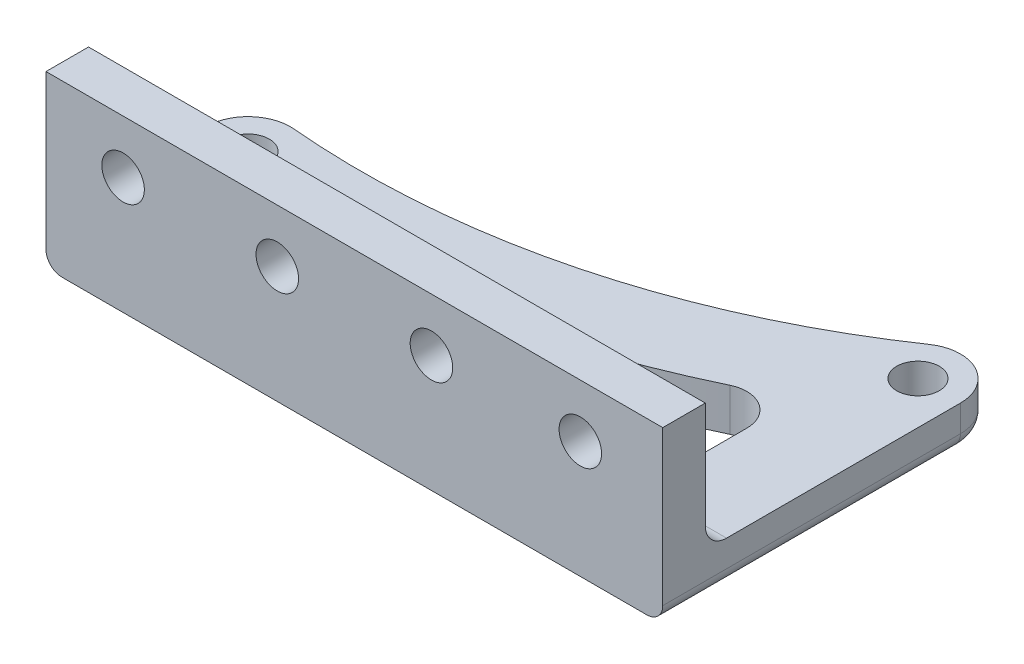
ISO-10303-21;
HEADER;
FILE_DESCRIPTION(('STEP AP214'),'2;1');
FILE_NAME('part.step','',(''),(''),'','','');
FILE_SCHEMA(('AUTOMOTIVE_DESIGN { 1 0 10303 214 1 1 1 1 }'));
ENDSEC;
DATA;
#1=APPLICATION_CONTEXT('core data for automotive mechanical design processes');
#2=APPLICATION_PROTOCOL_DEFINITION('international standard','automotive_design',2000,#1);
#3=PRODUCT_CONTEXT('',#1,'mechanical');
#4=PRODUCT('Part','Part','',(#3));
#5=PRODUCT_RELATED_PRODUCT_CATEGORY('part','',(#4));
#6=PRODUCT_DEFINITION_FORMATION('','',#4);
#7=PRODUCT_DEFINITION_CONTEXT('part definition',#1,'design');
#8=PRODUCT_DEFINITION('design','',#6,#7);
#9=PRODUCT_DEFINITION_SHAPE('','',#8);
#10=(LENGTH_UNIT() NAMED_UNIT(*) SI_UNIT(.MILLI.,.METRE.));
#11=(NAMED_UNIT(*) PLANE_ANGLE_UNIT() SI_UNIT($,.RADIAN.));
#12=(NAMED_UNIT(*) SI_UNIT($,.STERADIAN.) SOLID_ANGLE_UNIT());
#13=UNCERTAINTY_MEASURE_WITH_UNIT(LENGTH_MEASURE(1.E-05),#10,'distance_accuracy_value','');
#14=(GEOMETRIC_REPRESENTATION_CONTEXT(3) GLOBAL_UNCERTAINTY_ASSIGNED_CONTEXT((#13)) GLOBAL_UNIT_ASSIGNED_CONTEXT((#10,
#11,#12)) REPRESENTATION_CONTEXT('',''));
#15=CARTESIAN_POINT('',(0.,0.,0.));
#16=DIRECTION('',(0.,0.,1.));
#17=DIRECTION('',(1.,0.,0.));
#18=AXIS2_PLACEMENT_3D('',#15,#16,#17);
#19=CARTESIAN_POINT('',(-4.,4.,28.));
#20=DIRECTION('',(0.,0.,-1.));
#21=DIRECTION('',(1.,0.,0.));
#22=AXIS2_PLACEMENT_3D('',#19,#20,#21);
#23=PLANE('',#22);
#24=CARTESIAN_POINT('',(3.25,11.,28.));
#25=DIRECTION('',(0.,0.,1.));
#26=DIRECTION('',(1.,0.,0.));
#27=AXIS2_PLACEMENT_3D('',#24,#25,#26);
#28=CIRCLE('',#27,2.);
#29=CARTESIAN_POINT('',(5.25,11.,28.));
#30=VERTEX_POINT('',#29);
#31=EDGE_CURVE('E512',#30,#30,#28,.F.);
#32=ORIENTED_EDGE('',*,*,#31,.T.);
#33=EDGE_LOOP('',(#32));
#34=FACE_BOUND('',#33,.T.);
#35=CARTESIAN_POINT('',(17.75,11.,28.));
#36=DIRECTION('',(0.,0.,1.));
#37=DIRECTION('',(1.,0.,0.));
#38=AXIS2_PLACEMENT_3D('',#35,#36,#37);
#39=CIRCLE('',#38,2.);
#40=CARTESIAN_POINT('',(19.75,11.,28.));
#41=VERTEX_POINT('',#40);
#42=EDGE_CURVE('E198',#41,#41,#39,.F.);
#43=ORIENTED_EDGE('',*,*,#42,.T.);
#44=EDGE_LOOP('',(#43));
#45=FACE_BOUND('',#44,.T.);
#46=DIRECTION('',(0.,-1.,0.));
#47=VECTOR('',#46,1.);
#48=CARTESIAN_POINT('',(54.,4.,28.));
#49=LINE('',#48,#47);
#50=CARTESIAN_POINT('',(54.,16.,28.));
#51=VERTEX_POINT('',#50);
#52=CARTESIAN_POINT('',(54.,1.5,28.));
#53=VERTEX_POINT('',#52);
#54=EDGE_CURVE('E193',#51,#53,#49,.T.);
#55=ORIENTED_EDGE('',*,*,#54,.F.);
#56=DIRECTION('',(-1.,0.,0.));
#57=VECTOR('',#56,1.);
#58=CARTESIAN_POINT('',(54.,16.,28.));
#59=LINE('',#58,#57);
#60=CARTESIAN_POINT('',(-4.,16.,28.));
#61=VERTEX_POINT('',#60);
#62=EDGE_CURVE('E179',#51,#61,#59,.T.);
#63=ORIENTED_EDGE('',*,*,#62,.T.);
#64=DIRECTION('',(0.,-1.,0.));
#65=VECTOR('',#64,1.);
#66=CARTESIAN_POINT('',(-4.,4.,28.));
#67=LINE('',#66,#65);
#68=CARTESIAN_POINT('',(-4.,1.5,28.));
#69=VERTEX_POINT('',#68);
#70=EDGE_CURVE('E187',#61,#69,#67,.T.);
#71=ORIENTED_EDGE('',*,*,#70,.T.);
#72=CARTESIAN_POINT('',(-2.5,1.5,28.));
#73=DIRECTION('',(0.,0.,1.));
#74=DIRECTION('',(1.,0.,0.));
#75=AXIS2_PLACEMENT_3D('',#72,#73,#74);
#76=CIRCLE('',#75,1.5);
#77=CARTESIAN_POINT('',(-2.5,0.,28.));
#78=VERTEX_POINT('',#77);
#79=EDGE_CURVE('E335',#78,#69,#76,.F.);
#80=ORIENTED_EDGE('',*,*,#79,.F.);
#81=DIRECTION('',(-1.,0.,0.));
#82=VECTOR('',#81,1.);
#83=CARTESIAN_POINT('',(-4.,0.,28.));
#84=LINE('',#83,#82);
#85=CARTESIAN_POINT('',(52.5,0.,28.));
#86=VERTEX_POINT('',#85);
#87=EDGE_CURVE('E289',#86,#78,#84,.T.);
#88=ORIENTED_EDGE('',*,*,#87,.F.);
#89=CARTESIAN_POINT('',(52.5,1.5,28.));
#90=DIRECTION('',(0.,0.,1.));
#91=DIRECTION('',(1.,0.,0.));
#92=AXIS2_PLACEMENT_3D('',#89,#90,#91);
#93=CIRCLE('',#92,1.5);
#94=EDGE_CURVE('E337',#53,#86,#93,.F.);
#95=ORIENTED_EDGE('',*,*,#94,.F.);
#96=EDGE_LOOP('',(#55,#63,#71,#80,#88,#95));
#97=FACE_BOUND('',#96,.T.);
#98=CARTESIAN_POINT('',(32.25,11.,28.));
#99=DIRECTION('',(0.,0.,1.));
#100=DIRECTION('',(1.,0.,0.));
#101=AXIS2_PLACEMENT_3D('',#98,#99,#100);
#102=CIRCLE('',#101,2.);
#103=CARTESIAN_POINT('',(34.25,11.,28.));
#104=VERTEX_POINT('',#103);
#105=EDGE_CURVE('E497',#104,#104,#102,.T.);
#106=ORIENTED_EDGE('',*,*,#105,.F.);
#107=EDGE_LOOP('',(#106));
#108=FACE_BOUND('',#107,.T.);
#109=CARTESIAN_POINT('',(46.25,11.,28.));
#110=DIRECTION('',(0.,0.,1.));
#111=DIRECTION('',(1.,0.,0.));
#112=AXIS2_PLACEMENT_3D('',#109,#110,#111);
#113=CIRCLE('',#112,2.);
#114=CARTESIAN_POINT('',(48.25,11.,28.));
#115=VERTEX_POINT('',#114);
#116=EDGE_CURVE('E506',#115,#115,#113,.T.);
#117=ORIENTED_EDGE('',*,*,#116,.F.);
#118=EDGE_LOOP('',(#117));
#119=FACE_BOUND('',#118,.T.);
#120=ADVANCED_FACE('F37',(#34,#45,#97,#108,#119),#23,.F.);
#121=CARTESIAN_POINT('',(-4.,16.,24.));
#122=DIRECTION('',(0.,0.,1.));
#123=DIRECTION('',(-1.,0.,0.));
#124=AXIS2_PLACEMENT_3D('',#121,#122,#123);
#125=PLANE('',#124);
#126=CARTESIAN_POINT('',(3.25,11.,24.));
#127=DIRECTION('',(0.,0.,1.));
#128=DIRECTION('',(1.,0.,0.));
#129=AXIS2_PLACEMENT_3D('',#126,#127,#128);
#130=CIRCLE('',#129,2.);
#131=CARTESIAN_POINT('',(5.25,11.,24.));
#132=VERTEX_POINT('',#131);
#133=EDGE_CURVE('E509',#132,#132,#130,.T.);
#134=ORIENTED_EDGE('',*,*,#133,.T.);
#135=EDGE_LOOP('',(#134));
#136=FACE_BOUND('',#135,.T.);
#137=CARTESIAN_POINT('',(17.75,11.,24.));
#138=DIRECTION('',(0.,0.,1.));
#139=DIRECTION('',(1.,0.,0.));
#140=AXIS2_PLACEMENT_3D('',#137,#138,#139);
#141=CIRCLE('',#140,2.);
#142=CARTESIAN_POINT('',(19.75,11.,24.));
#143=VERTEX_POINT('',#142);
#144=EDGE_CURVE('E201',#143,#143,#141,.T.);
#145=ORIENTED_EDGE('',*,*,#144,.T.);
#146=EDGE_LOOP('',(#145));
#147=FACE_BOUND('',#146,.T.);
#148=DIRECTION('',(0.,-1.,0.));
#149=VECTOR('',#148,1.);
#150=CARTESIAN_POINT('',(-4.,16.,24.));
#151=LINE('',#150,#149);
#152=CARTESIAN_POINT('',(-4.,16.,24.));
#153=VERTEX_POINT('',#152);
#154=CARTESIAN_POINT('',(-4.,6.,24.));
#155=VERTEX_POINT('',#154);
#156=EDGE_CURVE('E211',#153,#155,#151,.T.);
#157=ORIENTED_EDGE('',*,*,#156,.F.);
#158=DIRECTION('',(1.,0.,0.));
#159=VECTOR('',#158,1.);
#160=CARTESIAN_POINT('',(-4.,16.,24.));
#161=LINE('',#160,#159);
#162=CARTESIAN_POINT('',(54.,16.,24.));
#163=VERTEX_POINT('',#162);
#164=EDGE_CURVE('E182',#153,#163,#161,.T.);
#165=ORIENTED_EDGE('',*,*,#164,.T.);
#166=DIRECTION('',(0.,-1.,0.));
#167=VECTOR('',#166,1.);
#168=CARTESIAN_POINT('',(54.,16.,24.));
#169=LINE('',#168,#167);
#170=CARTESIAN_POINT('',(54.,6.,24.));
#171=VERTEX_POINT('',#170);
#172=EDGE_CURVE('E208',#163,#171,#169,.T.);
#173=ORIENTED_EDGE('',*,*,#172,.T.);
#174=DIRECTION('',(1.,0.,0.));
#175=VECTOR('',#174,1.);
#176=CARTESIAN_POINT('',(-4.,6.,24.));
#177=LINE('',#176,#175);
#178=EDGE_CURVE('E311',#155,#171,#177,.T.);
#179=ORIENTED_EDGE('',*,*,#178,.F.);
#180=EDGE_LOOP('',(#157,#165,#173,#179));
#181=FACE_BOUND('',#180,.T.);
#182=CARTESIAN_POINT('',(32.25,11.,24.));
#183=DIRECTION('',(0.,0.,1.));
#184=DIRECTION('',(1.,0.,0.));
#185=AXIS2_PLACEMENT_3D('',#182,#183,#184);
#186=CIRCLE('',#185,2.);
#187=CARTESIAN_POINT('',(34.25,11.,24.));
#188=VERTEX_POINT('',#187);
#189=EDGE_CURVE('E500',#188,#188,#186,.F.);
#190=ORIENTED_EDGE('',*,*,#189,.F.);
#191=EDGE_LOOP('',(#190));
#192=FACE_BOUND('',#191,.T.);
#193=CARTESIAN_POINT('',(46.25,11.,24.));
#194=DIRECTION('',(0.,0.,1.));
#195=DIRECTION('',(1.,0.,0.));
#196=AXIS2_PLACEMENT_3D('',#193,#194,#195);
#197=CIRCLE('',#196,2.);
#198=CARTESIAN_POINT('',(48.25,11.,24.));
#199=VERTEX_POINT('',#198);
#200=EDGE_CURVE('E503',#199,#199,#197,.F.);
#201=ORIENTED_EDGE('',*,*,#200,.F.);
#202=EDGE_LOOP('',(#201));
#203=FACE_BOUND('',#202,.T.);
#204=ADVANCED_FACE('F397',(#136,#147,#181,#192,#203),#125,.F.);
#205=CARTESIAN_POINT('',(0.,1.5,13.));
#206=DIRECTION('',(0.,1.,0.));
#207=DIRECTION('',(0.,0.,-1.));
#208=AXIS2_PLACEMENT_3D('',#205,#206,#207);
#209=TOROIDAL_SURFACE('',#208,2.5,1.5);
#210=CARTESIAN_POINT('',(-2.5,1.5,13.));
#211=DIRECTION('',(0.,0.,-1.));
#212=DIRECTION('',(-1.,0.,0.));
#213=AXIS2_PLACEMENT_3D('',#210,#211,#212);
#214=CIRCLE('',#213,1.5);
#215=CARTESIAN_POINT('',(-2.5,0.,13.));
#216=VERTEX_POINT('',#215);
#217=CARTESIAN_POINT('',(-4.,1.5,13.));
#218=VERTEX_POINT('',#217);
#219=EDGE_CURVE('E11',#216,#218,#214,.T.);
#220=ORIENTED_EDGE('',*,*,#219,.T.);
#221=CARTESIAN_POINT('',(0.,1.5,13.));
#222=DIRECTION('',(0.,-1.,0.));
#223=DIRECTION('',(0.,0.,-1.));
#224=AXIS2_PLACEMENT_3D('',#221,#222,#223);
#225=CIRCLE('',#224,4.);
#226=CARTESIAN_POINT('',(0.361009591024995,1.5,9.0163243009517));
#227=VERTEX_POINT('',#226);
#228=EDGE_CURVE('E346',#218,#227,#225,.T.);
#229=ORIENTED_EDGE('',*,*,#228,.T.);
#230=CARTESIAN_POINT('',(0.225630994390629,1.5,10.5102026880948));
#231=DIRECTION('',(0.995918924762076,0.,0.090252397756244));
#232=DIRECTION('',(0.090252397756244,0.,-0.995918924762076));
#233=AXIS2_PLACEMENT_3D('',#230,#231,#232);
#234=CIRCLE('',#233,1.5);
#235=CARTESIAN_POINT('',(0.225630994390622,0.,10.5102026880948));
#236=VERTEX_POINT('',#235);
#237=EDGE_CURVE('E45',#236,#227,#234,.T.);
#238=ORIENTED_EDGE('',*,*,#237,.F.);
#239=CARTESIAN_POINT('',(0.,0.,13.));
#240=DIRECTION('',(0.,-1.,0.));
#241=DIRECTION('',(0.,0.,-1.));
#242=AXIS2_PLACEMENT_3D('',#239,#240,#241);
#243=CIRCLE('',#242,2.5);
#244=EDGE_CURVE('E324',#236,#216,#243,.F.);
#245=ORIENTED_EDGE('',*,*,#244,.T.);
#246=EDGE_LOOP('',(#220,#229,#238,#245));
#247=FACE_BOUND('',#246,.T.);
#248=ADVANCED_FACE('F363',(#247),#209,.T.);
#249=CARTESIAN_POINT('',(6.89832871152092,1.5,-63.1218126479964));
#250=DIRECTION('',(0.,1.,0.));
#251=DIRECTION('',(0.,0.,-1.));
#252=AXIS2_PLACEMENT_3D('',#249,#250,#251);
#253=TOROIDAL_SURFACE('',#252,73.9337445100583,1.5);
#254=ORIENTED_EDGE('',*,*,#237,.T.);
#255=CARTESIAN_POINT('',(6.89832871152092,1.5,-63.1218126479964));
#256=DIRECTION('',(0.,-1.,0.));
#257=DIRECTION('',(0.,0.,-1.));
#258=AXIS2_PLACEMENT_3D('',#255,#256,#257);
#259=CIRCLE('',#258,72.4337445100582);
#260=CARTESIAN_POINT('',(47.7443642692237,1.5,-3.30334791537996));
#261=VERTEX_POINT('',#260);
#262=EDGE_CURVE('E343',#227,#261,#259,.F.);
#263=ORIENTED_EDGE('',*,*,#262,.T.);
#264=CARTESIAN_POINT('',(48.5902276682648,1.5,-2.06459244711248));
#265=DIRECTION('',(0.825836978844991,0.,-0.563908932694082));
#266=DIRECTION('',(-0.563908932694082,0.,-0.825836978844991));
#267=AXIS2_PLACEMENT_3D('',#264,#265,#266);
#268=CIRCLE('',#267,1.5);
#269=CARTESIAN_POINT('',(48.5902276682648,0.,-2.06459244711248));
#270=VERTEX_POINT('',#269);
#271=EDGE_CURVE('E353',#270,#261,#268,.T.);
#272=ORIENTED_EDGE('',*,*,#271,.F.);
#273=CARTESIAN_POINT('',(6.89832871152092,0.,-63.1218126479964));
#274=DIRECTION('',(0.,-1.,0.));
#275=DIRECTION('',(0.,0.,-1.));
#276=AXIS2_PLACEMENT_3D('',#273,#274,#275);
#277=CIRCLE('',#276,73.9337445100583);
#278=EDGE_CURVE('E327',#270,#236,#277,.T.);
#279=ORIENTED_EDGE('',*,*,#278,.T.);
#280=EDGE_LOOP('',(#254,#263,#272,#279));
#281=FACE_BOUND('',#280,.T.);
#282=ADVANCED_FACE('F358',(#281),#253,.T.);
#283=CARTESIAN_POINT('',(50.,1.5,0.));
#284=DIRECTION('',(0.,1.,0.));
#285=DIRECTION('',(0.,0.,-1.));
#286=AXIS2_PLACEMENT_3D('',#283,#284,#285);
#287=TOROIDAL_SURFACE('',#286,2.50000000000001,1.5);
#288=ORIENTED_EDGE('',*,*,#271,.T.);
#289=CARTESIAN_POINT('',(50.,1.5,0.));
#290=DIRECTION('',(0.,-1.,0.));
#291=DIRECTION('',(0.,0.,-1.));
#292=AXIS2_PLACEMENT_3D('',#289,#290,#291);
#293=CIRCLE('',#292,4.00000000000001);
#294=CARTESIAN_POINT('',(54.,1.5,0.));
#295=VERTEX_POINT('',#294);
#296=EDGE_CURVE('E340',#261,#295,#293,.T.);
#297=ORIENTED_EDGE('',*,*,#296,.T.);
#298=CARTESIAN_POINT('',(52.5,1.5,0.));
#299=DIRECTION('',(0.,0.,1.));
#300=DIRECTION('',(1.,0.,0.));
#301=AXIS2_PLACEMENT_3D('',#298,#299,#300);
#302=CIRCLE('',#301,1.5);
#303=CARTESIAN_POINT('',(52.5,0.,0.));
#304=VERTEX_POINT('',#303);
#305=EDGE_CURVE('E350',#304,#295,#302,.T.);
#306=ORIENTED_EDGE('',*,*,#305,.F.);
#307=CARTESIAN_POINT('',(50.,0.,0.));
#308=DIRECTION('',(0.,-1.,0.));
#309=DIRECTION('',(0.,0.,-1.));
#310=AXIS2_PLACEMENT_3D('',#307,#308,#309);
#311=CIRCLE('',#310,2.50000000000001);
#312=EDGE_CURVE('E329',#304,#270,#311,.F.);
#313=ORIENTED_EDGE('',*,*,#312,.T.);
#314=EDGE_LOOP('',(#288,#297,#306,#313));
#315=FACE_BOUND('',#314,.T.);
#316=ADVANCED_FACE('F382',(#315),#287,.T.);
#317=CARTESIAN_POINT('',(52.5,1.5,13.));
#318=DIRECTION('',(0.,0.,-1.));
#319=DIRECTION('',(1.,0.,0.));
#320=AXIS2_PLACEMENT_3D('',#317,#318,#319);
#321=CYLINDRICAL_SURFACE('',#320,1.5);
#322=ORIENTED_EDGE('',*,*,#305,.T.);
#323=DIRECTION('',(0.,0.,-1.));
#324=VECTOR('',#323,1.);
#325=CARTESIAN_POINT('',(54.,1.5,28.));
#326=LINE('',#325,#324);
#327=EDGE_CURVE('E333',#295,#53,#326,.F.);
#328=ORIENTED_EDGE('',*,*,#327,.T.);
#329=ORIENTED_EDGE('',*,*,#94,.T.);
#330=DIRECTION('',(0.,0.,-1.));
#331=VECTOR('',#330,1.);
#332=CARTESIAN_POINT('',(52.5,0.,13.));
#333=LINE('',#332,#331);
#334=EDGE_CURVE('E331',#86,#304,#333,.T.);
#335=ORIENTED_EDGE('',*,*,#334,.T.);
#336=EDGE_LOOP('',(#322,#328,#329,#335));
#337=FACE_BOUND('',#336,.T.);
#338=ADVANCED_FACE('F390',(#337),#321,.T.);
#339=CARTESIAN_POINT('',(-2.5,1.5,13.));
#340=DIRECTION('',(0.,0.,1.));
#341=DIRECTION('',(-1.,0.,0.));
#342=AXIS2_PLACEMENT_3D('',#339,#340,#341);
#343=CYLINDRICAL_SURFACE('',#342,1.5);
#344=DIRECTION('',(0.,0.,1.));
#345=VECTOR('',#344,1.);
#346=CARTESIAN_POINT('',(-2.5,0.,13.));
#347=LINE('',#346,#345);
#348=EDGE_CURVE('E322',#216,#78,#347,.T.);
#349=ORIENTED_EDGE('',*,*,#348,.T.);
#350=ORIENTED_EDGE('',*,*,#79,.T.);
#351=DIRECTION('',(0.,0.,1.));
#352=VECTOR('',#351,1.);
#353=CARTESIAN_POINT('',(-4.,1.5,13.));
#354=LINE('',#353,#352);
#355=EDGE_CURVE('E189',#69,#218,#354,.F.);
#356=ORIENTED_EDGE('',*,*,#355,.T.);
#357=ORIENTED_EDGE('',*,*,#219,.F.);
#358=EDGE_LOOP('',(#349,#350,#356,#357));
#359=FACE_BOUND('',#358,.T.);
#360=ADVANCED_FACE('F39',(#359),#343,.T.);
#361=CARTESIAN_POINT('',(-4.,6.,22.));
#362=DIRECTION('',(1.,0.,0.));
#363=DIRECTION('',(0.,0.,1.));
#364=AXIS2_PLACEMENT_3D('',#361,#362,#363);
#365=CYLINDRICAL_SURFACE('',#364,2.);
#366=ORIENTED_EDGE('',*,*,#178,.T.);
#367=CARTESIAN_POINT('',(54.,6.,22.));
#368=DIRECTION('',(1.,0.,0.));
#369=DIRECTION('',(0.,0.,-1.));
#370=AXIS2_PLACEMENT_3D('',#367,#368,#369);
#371=CIRCLE('',#370,2.);
#372=CARTESIAN_POINT('',(54.,4.,22.));
#373=VERTEX_POINT('',#372);
#374=EDGE_CURVE('E320',#373,#171,#371,.F.);
#375=ORIENTED_EDGE('',*,*,#374,.F.);
#376=DIRECTION('',(1.,0.,0.));
#377=VECTOR('',#376,1.);
#378=CARTESIAN_POINT('',(0.,4.,22.));
#379=LINE('',#378,#377);
#380=CARTESIAN_POINT('',(-4.,4.,22.));
#381=VERTEX_POINT('',#380);
#382=EDGE_CURVE('E314',#373,#381,#379,.F.);
#383=ORIENTED_EDGE('',*,*,#382,.T.);
#384=CARTESIAN_POINT('',(-4.,6.,22.));
#385=DIRECTION('',(-1.,0.,0.));
#386=DIRECTION('',(0.,0.,1.));
#387=AXIS2_PLACEMENT_3D('',#384,#385,#386);
#388=CIRCLE('',#387,2.);
#389=EDGE_CURVE('E317',#155,#381,#388,.F.);
#390=ORIENTED_EDGE('',*,*,#389,.F.);
#391=EDGE_LOOP('',(#366,#375,#383,#390));
#392=FACE_BOUND('',#391,.T.);
#393=ADVANCED_FACE('F400',(#392),#365,.F.);
#394=CARTESIAN_POINT('',(0.,4.,13.));
#395=DIRECTION('',(0.,1.,0.));
#396=DIRECTION('',(0.,0.,-1.));
#397=AXIS2_PLACEMENT_3D('',#394,#395,#396);
#398=PLANE('',#397);
#399=DIRECTION('',(0.,0.,1.));
#400=VECTOR('',#399,1.);
#401=CARTESIAN_POINT('',(54.,4.,28.));
#402=LINE('',#401,#400);
#403=CARTESIAN_POINT('',(54.,4.,0.));
#404=VERTEX_POINT('',#403);
#405=EDGE_CURVE('E298',#404,#373,#402,.T.);
#406=ORIENTED_EDGE('',*,*,#405,.F.);
#407=CARTESIAN_POINT('',(50.,4.,0.));
#408=DIRECTION('',(0.,-1.,0.));
#409=DIRECTION('',(0.,0.,-1.));
#410=AXIS2_PLACEMENT_3D('',#407,#408,#409);
#411=CIRCLE('',#410,4.00000000000001);
#412=CARTESIAN_POINT('',(47.7443642692237,4.,-3.30334791537996));
#413=VERTEX_POINT('',#412);
#414=EDGE_CURVE('E295',#413,#404,#411,.T.);
#415=ORIENTED_EDGE('',*,*,#414,.F.);
#416=CARTESIAN_POINT('',(6.89832871152092,4.,-63.1218126479964));
#417=DIRECTION('',(0.,1.,0.));
#418=DIRECTION('',(0.,0.,-1.));
#419=AXIS2_PLACEMENT_3D('',#416,#417,#418);
#420=CIRCLE('',#419,72.4337445100582);
#421=CARTESIAN_POINT('',(0.361009591024995,4.,9.0163243009517));
#422=VERTEX_POINT('',#421);
#423=EDGE_CURVE('E292',#422,#413,#420,.T.);
#424=ORIENTED_EDGE('',*,*,#423,.F.);
#425=CARTESIAN_POINT('',(0.,4.,13.));
#426=DIRECTION('',(0.,-1.,0.));
#427=DIRECTION('',(0.,0.,-1.));
#428=AXIS2_PLACEMENT_3D('',#425,#426,#427);
#429=CIRCLE('',#428,4.);
#430=CARTESIAN_POINT('',(-4.,4.,13.));
#431=VERTEX_POINT('',#430);
#432=EDGE_CURVE('E290',#431,#422,#429,.T.);
#433=ORIENTED_EDGE('',*,*,#432,.F.);
#434=DIRECTION('',(0.,0.,-1.));
#435=VECTOR('',#434,1.);
#436=CARTESIAN_POINT('',(-4.,4.,13.));
#437=LINE('',#436,#435);
#438=EDGE_CURVE('E300',#381,#431,#437,.T.);
#439=ORIENTED_EDGE('',*,*,#438,.F.);
#440=ORIENTED_EDGE('',*,*,#382,.F.);
#441=EDGE_LOOP('',(#406,#415,#424,#433,#439,#440));
#442=FACE_BOUND('',#441,.T.);
#443=CARTESIAN_POINT('',(0.,4.,13.));
#444=DIRECTION('',(0.,-1.,0.));
#445=DIRECTION('',(0.,0.,-1.));
#446=AXIS2_PLACEMENT_3D('',#443,#444,#445);
#447=CIRCLE('',#446,2.);
#448=CARTESIAN_POINT('',(0.,4.,11.));
#449=VERTEX_POINT('',#448);
#450=EDGE_CURVE('E220',#449,#449,#447,.T.);
#451=ORIENTED_EDGE('',*,*,#450,.T.);
#452=EDGE_LOOP('',(#451));
#453=FACE_BOUND('',#452,.T.);
#454=CARTESIAN_POINT('',(43.,4.,12.0969287210818));
#455=DIRECTION('',(0.,-1.,0.));
#456=DIRECTION('',(0.,0.,1.));
#457=AXIS2_PLACEMENT_3D('',#454,#455,#456);
#458=CIRCLE('',#457,3.00000000000001);
#459=CARTESIAN_POINT('',(41.7019039538327,4.,9.3923129156623));
#460=VERTEX_POINT('',#459);
#461=CARTESIAN_POINT('',(46.,4.,12.0969287210818));
#462=VERTEX_POINT('',#461);
#463=EDGE_CURVE('E229',#460,#462,#458,.T.);
#464=ORIENTED_EDGE('',*,*,#463,.T.);
#465=DIRECTION('',(0.,0.,1.));
#466=VECTOR('',#465,1.);
#467=CARTESIAN_POINT('',(46.,4.,12.0969287210818));
#468=LINE('',#467,#466);
#469=CARTESIAN_POINT('',(46.,4.,17.));
#470=VERTEX_POINT('',#469);
#471=EDGE_CURVE('E233',#462,#470,#468,.T.);
#472=ORIENTED_EDGE('',*,*,#471,.T.);
#473=CARTESIAN_POINT('',(43.,4.,17.));
#474=DIRECTION('',(0.,-1.,0.));
#475=DIRECTION('',(0.,0.,-1.));
#476=AXIS2_PLACEMENT_3D('',#473,#474,#475);
#477=CIRCLE('',#476,3.);
#478=CARTESIAN_POINT('',(43.,4.,20.));
#479=VERTEX_POINT('',#478);
#480=EDGE_CURVE('E236',#470,#479,#477,.T.);
#481=ORIENTED_EDGE('',*,*,#480,.T.);
#482=DIRECTION('',(-1.,0.,0.));
#483=VECTOR('',#482,1.);
#484=CARTESIAN_POINT('',(25.,4.,20.));
#485=LINE('',#484,#483);
#486=CARTESIAN_POINT('',(5.00000000000001,4.,20.));
#487=VERTEX_POINT('',#486);
#488=EDGE_CURVE('E239',#479,#487,#485,.T.);
#489=ORIENTED_EDGE('',*,*,#488,.T.);
#490=CARTESIAN_POINT('',(5.,4.,19.));
#491=DIRECTION('',(0.,-1.,0.));
#492=DIRECTION('',(0.,0.,-1.));
#493=AXIS2_PLACEMENT_3D('',#490,#491,#492);
#494=CIRCLE('',#493,1.);
#495=CARTESIAN_POINT('',(4.,4.,19.));
#496=VERTEX_POINT('',#495);
#497=EDGE_CURVE('E242',#487,#496,#494,.T.);
#498=ORIENTED_EDGE('',*,*,#497,.T.);
#499=DIRECTION('',(0.,0.,-1.));
#500=VECTOR('',#499,1.);
#501=CARTESIAN_POINT('',(4.,4.,18.2898025738652));
#502=LINE('',#501,#500);
#503=CARTESIAN_POINT('',(4.,4.,18.2898025738652));
#504=VERTEX_POINT('',#503);
#505=EDGE_CURVE('E245',#496,#504,#502,.T.);
#506=ORIENTED_EDGE('',*,*,#505,.T.);
#507=CARTESIAN_POINT('',(5.,4.,18.2898025738652));
#508=DIRECTION('',(0.,-1.,0.));
#509=DIRECTION('',(0.,0.,1.));
#510=AXIS2_PLACEMENT_3D('',#507,#508,#509);
#511=CIRCLE('',#510,1.);
#512=CARTESIAN_POINT('',(5.02331132779098,4.,17.2900743197898));
#513=VERTEX_POINT('',#512);
#514=EDGE_CURVE('E248',#504,#513,#511,.T.);
#515=ORIENTED_EDGE('',*,*,#514,.T.);
#516=CARTESIAN_POINT('',(6.89832871152092,4.,-63.1218126479964));
#517=DIRECTION('',(0.,1.,0.));
#518=DIRECTION('',(0.,0.,-1.));
#519=AXIS2_PLACEMENT_3D('',#516,#517,#518);
#520=CIRCLE('',#519,80.4337445100582);
#521=EDGE_CURVE('E226',#513,#460,#520,.T.);
#522=ORIENTED_EDGE('',*,*,#521,.T.);
#523=EDGE_LOOP('',(#464,#472,#481,#489,#498,#506,#515,#522));
#524=FACE_BOUND('',#523,.T.);
#525=CARTESIAN_POINT('',(50.,4.,0.));
#526=DIRECTION('',(0.,-1.,0.));
#527=DIRECTION('',(0.,0.,-1.));
#528=AXIS2_PLACEMENT_3D('',#525,#526,#527);
#529=CIRCLE('',#528,2.);
#530=CARTESIAN_POINT('',(50.,4.,-2.));
#531=VERTEX_POINT('',#530);
#532=EDGE_CURVE('E214',#531,#531,#529,.T.);
#533=ORIENTED_EDGE('',*,*,#532,.T.);
#534=EDGE_LOOP('',(#533));
#535=FACE_BOUND('',#534,.T.);
#536=ADVANCED_FACE('F371',(#442,#453,#524,#535),#398,.T.);
#537=CARTESIAN_POINT('',(0.,0.,13.));
#538=DIRECTION('',(0.,1.,0.));
#539=DIRECTION('',(0.,0.,-1.));
#540=AXIS2_PLACEMENT_3D('',#537,#538,#539);
#541=PLANE('',#540);
#542=ORIENTED_EDGE('',*,*,#87,.T.);
#543=ORIENTED_EDGE('',*,*,#348,.F.);
#544=ORIENTED_EDGE('',*,*,#244,.F.);
#545=ORIENTED_EDGE('',*,*,#278,.F.);
#546=ORIENTED_EDGE('',*,*,#312,.F.);
#547=ORIENTED_EDGE('',*,*,#334,.F.);
#548=EDGE_LOOP('',(#542,#543,#544,#545,#546,#547));
#549=FACE_BOUND('',#548,.T.);
#550=CARTESIAN_POINT('',(6.89832871152092,0.,-63.1218126479964));
#551=DIRECTION('',(0.,1.,0.));
#552=DIRECTION('',(0.,0.,-1.));
#553=AXIS2_PLACEMENT_3D('',#550,#551,#552);
#554=CIRCLE('',#553,80.4337445100582);
#555=CARTESIAN_POINT('',(5.02331132779098,0.,17.2900743197898));
#556=VERTEX_POINT('',#555);
#557=CARTESIAN_POINT('',(41.7019039538327,0.,9.3923129156623));
#558=VERTEX_POINT('',#557);
#559=EDGE_CURVE('E223',#556,#558,#554,.T.);
#560=ORIENTED_EDGE('',*,*,#559,.F.);
#561=CARTESIAN_POINT('',(5.,0.,18.2898025738652));
#562=DIRECTION('',(0.,-1.,0.));
#563=DIRECTION('',(0.,0.,1.));
#564=AXIS2_PLACEMENT_3D('',#561,#562,#563);
#565=CIRCLE('',#564,1.);
#566=CARTESIAN_POINT('',(4.,0.,18.2898025738652));
#567=VERTEX_POINT('',#566);
#568=EDGE_CURVE('E230',#567,#556,#565,.T.);
#569=ORIENTED_EDGE('',*,*,#568,.F.);
#570=DIRECTION('',(0.,0.,-1.));
#571=VECTOR('',#570,1.);
#572=CARTESIAN_POINT('',(4.,0.,18.2898025738652));
#573=LINE('',#572,#571);
#574=CARTESIAN_POINT('',(4.,0.,19.));
#575=VERTEX_POINT('',#574);
#576=EDGE_CURVE('E269',#575,#567,#573,.T.);
#577=ORIENTED_EDGE('',*,*,#576,.F.);
#578=CARTESIAN_POINT('',(5.,0.,19.));
#579=DIRECTION('',(0.,-1.,0.));
#580=DIRECTION('',(0.,0.,-1.));
#581=AXIS2_PLACEMENT_3D('',#578,#579,#580);
#582=CIRCLE('',#581,1.);
#583=CARTESIAN_POINT('',(5.00000000000001,0.,20.));
#584=VERTEX_POINT('',#583);
#585=EDGE_CURVE('E266',#584,#575,#582,.T.);
#586=ORIENTED_EDGE('',*,*,#585,.F.);
#587=DIRECTION('',(-1.,0.,0.));
#588=VECTOR('',#587,1.);
#589=CARTESIAN_POINT('',(25.,0.,20.));
#590=LINE('',#589,#588);
#591=CARTESIAN_POINT('',(43.,0.,20.));
#592=VERTEX_POINT('',#591);
#593=EDGE_CURVE('E263',#592,#584,#590,.T.);
#594=ORIENTED_EDGE('',*,*,#593,.F.);
#595=CARTESIAN_POINT('',(43.,0.,17.));
#596=DIRECTION('',(0.,-1.,0.));
#597=DIRECTION('',(0.,0.,-1.));
#598=AXIS2_PLACEMENT_3D('',#595,#596,#597);
#599=CIRCLE('',#598,3.);
#600=CARTESIAN_POINT('',(46.,0.,17.));
#601=VERTEX_POINT('',#600);
#602=EDGE_CURVE('E260',#601,#592,#599,.T.);
#603=ORIENTED_EDGE('',*,*,#602,.F.);
#604=DIRECTION('',(0.,0.,1.));
#605=VECTOR('',#604,1.);
#606=CARTESIAN_POINT('',(46.,0.,12.0969287210818));
#607=LINE('',#606,#605);
#608=CARTESIAN_POINT('',(46.,0.,12.0969287210818));
#609=VERTEX_POINT('',#608);
#610=EDGE_CURVE('E257',#609,#601,#607,.T.);
#611=ORIENTED_EDGE('',*,*,#610,.F.);
#612=CARTESIAN_POINT('',(43.,0.,12.0969287210818));
#613=DIRECTION('',(0.,-1.,0.));
#614=DIRECTION('',(0.,0.,1.));
#615=AXIS2_PLACEMENT_3D('',#612,#613,#614);
#616=CIRCLE('',#615,3.00000000000001);
#617=EDGE_CURVE('E254',#558,#609,#616,.T.);
#618=ORIENTED_EDGE('',*,*,#617,.F.);
#619=EDGE_LOOP('',(#560,#569,#577,#586,#594,#603,#611,#618));
#620=FACE_BOUND('',#619,.T.);
#621=CARTESIAN_POINT('',(0.,0.,13.));
#622=DIRECTION('',(0.,-1.,0.));
#623=DIRECTION('',(0.,0.,-1.));
#624=AXIS2_PLACEMENT_3D('',#621,#622,#623);
#625=CIRCLE('',#624,2.);
#626=CARTESIAN_POINT('',(0.,0.,11.));
#627=VERTEX_POINT('',#626);
#628=EDGE_CURVE('E217',#627,#627,#625,.T.);
#629=ORIENTED_EDGE('',*,*,#628,.F.);
#630=EDGE_LOOP('',(#629));
#631=FACE_BOUND('',#630,.T.);
#632=CARTESIAN_POINT('',(50.,0.,0.));
#633=DIRECTION('',(0.,-1.,0.));
#634=DIRECTION('',(0.,0.,-1.));
#635=AXIS2_PLACEMENT_3D('',#632,#633,#634);
#636=CIRCLE('',#635,2.);
#637=CARTESIAN_POINT('',(50.,0.,-2.));
#638=VERTEX_POINT('',#637);
#639=EDGE_CURVE('E213',#638,#638,#636,.T.);
#640=ORIENTED_EDGE('',*,*,#639,.F.);
#641=EDGE_LOOP('',(#640));
#642=FACE_BOUND('',#641,.T.);
#643=ADVANCED_FACE('F385',(#549,#620,#631,#642),#541,.F.);
#644=CARTESIAN_POINT('',(0.,4.,13.));
#645=DIRECTION('',(0.,-1.,0.));
#646=DIRECTION('',(0.,0.,1.));
#647=AXIS2_PLACEMENT_3D('',#644,#645,#646);
#648=CYLINDRICAL_SURFACE('',#647,4.);
#649=DIRECTION('',(0.,-1.,0.));
#650=VECTOR('',#649,1.);
#651=CARTESIAN_POINT('',(-4.,4.,13.));
#652=LINE('',#651,#650);
#653=EDGE_CURVE('E52',#431,#218,#652,.T.);
#654=ORIENTED_EDGE('',*,*,#653,.F.);
#655=ORIENTED_EDGE('',*,*,#432,.T.);
#656=DIRECTION('',(0.,-1.,0.));
#657=VECTOR('',#656,1.);
#658=CARTESIAN_POINT('',(0.361009591024995,4.,9.0163243009517));
#659=LINE('',#658,#657);
#660=EDGE_CURVE('E60',#422,#227,#659,.T.);
#661=ORIENTED_EDGE('',*,*,#660,.T.);
#662=ORIENTED_EDGE('',*,*,#228,.F.);
#663=EDGE_LOOP('',(#654,#655,#661,#662));
#664=FACE_BOUND('',#663,.T.);
#665=ADVANCED_FACE('F365',(#664),#648,.T.);
#666=CARTESIAN_POINT('',(6.89832871152092,4.,-63.1218126479964));
#667=DIRECTION('',(0.,-1.,0.));
#668=DIRECTION('',(0.,0.,1.));
#669=AXIS2_PLACEMENT_3D('',#666,#667,#668);
#670=CYLINDRICAL_SURFACE('',#669,72.4337445100582);
#671=ORIENTED_EDGE('',*,*,#660,.F.);
#672=ORIENTED_EDGE('',*,*,#423,.T.);
#673=DIRECTION('',(0.,-1.,0.));
#674=VECTOR('',#673,1.);
#675=CARTESIAN_POINT('',(47.7443642692237,4.,-3.30334791537996));
#676=LINE('',#675,#674);
#677=EDGE_CURVE('E308',#413,#261,#676,.T.);
#678=ORIENTED_EDGE('',*,*,#677,.T.);
#679=ORIENTED_EDGE('',*,*,#262,.F.);
#680=EDGE_LOOP('',(#671,#672,#678,#679));
#681=FACE_BOUND('',#680,.T.);
#682=ADVANCED_FACE('F375',(#681),#670,.F.);
#683=CARTESIAN_POINT('',(50.,4.,0.));
#684=DIRECTION('',(0.,-1.,0.));
#685=DIRECTION('',(0.,0.,1.));
#686=AXIS2_PLACEMENT_3D('',#683,#684,#685);
#687=CYLINDRICAL_SURFACE('',#686,4.00000000000001);
#688=ORIENTED_EDGE('',*,*,#677,.F.);
#689=ORIENTED_EDGE('',*,*,#414,.T.);
#690=DIRECTION('',(0.,-1.,0.));
#691=VECTOR('',#690,1.);
#692=CARTESIAN_POINT('',(54.,4.,0.));
#693=LINE('',#692,#691);
#694=EDGE_CURVE('E306',#404,#295,#693,.T.);
#695=ORIENTED_EDGE('',*,*,#694,.T.);
#696=ORIENTED_EDGE('',*,*,#296,.F.);
#697=EDGE_LOOP('',(#688,#689,#695,#696));
#698=FACE_BOUND('',#697,.T.);
#699=ADVANCED_FACE('F378',(#698),#687,.T.);
#700=CARTESIAN_POINT('',(54.,4.,28.));
#701=DIRECTION('',(-1.,0.,0.));
#702=DIRECTION('',(0.,0.,-1.));
#703=AXIS2_PLACEMENT_3D('',#700,#701,#702);
#704=PLANE('',#703);
#705=ORIENTED_EDGE('',*,*,#694,.F.);
#706=ORIENTED_EDGE('',*,*,#405,.T.);
#707=ORIENTED_EDGE('',*,*,#374,.T.);
#708=ORIENTED_EDGE('',*,*,#172,.F.);
#709=DIRECTION('',(0.,0.,1.));
#710=VECTOR('',#709,1.);
#711=CARTESIAN_POINT('',(54.,16.,24.));
#712=LINE('',#711,#710);
#713=EDGE_CURVE('E206',#163,#51,#712,.T.);
#714=ORIENTED_EDGE('',*,*,#713,.T.);
#715=ORIENTED_EDGE('',*,*,#54,.T.);
#716=ORIENTED_EDGE('',*,*,#327,.F.);
#717=EDGE_LOOP('',(#705,#706,#707,#708,#714,#715,#716));
#718=FACE_BOUND('',#717,.T.);
#719=ADVANCED_FACE('F392',(#718),#704,.F.);
#720=CARTESIAN_POINT('',(-4.,4.,13.));
#721=DIRECTION('',(1.,0.,0.));
#722=DIRECTION('',(0.,0.,1.));
#723=AXIS2_PLACEMENT_3D('',#720,#721,#722);
#724=PLANE('',#723);
#725=ORIENTED_EDGE('',*,*,#70,.F.);
#726=DIRECTION('',(0.,0.,-1.));
#727=VECTOR('',#726,1.);
#728=CARTESIAN_POINT('',(-4.,16.,28.));
#729=LINE('',#728,#727);
#730=EDGE_CURVE('E175',#61,#153,#729,.T.);
#731=ORIENTED_EDGE('',*,*,#730,.T.);
#732=ORIENTED_EDGE('',*,*,#156,.T.);
#733=ORIENTED_EDGE('',*,*,#389,.T.);
#734=ORIENTED_EDGE('',*,*,#438,.T.);
#735=ORIENTED_EDGE('',*,*,#653,.T.);
#736=ORIENTED_EDGE('',*,*,#355,.F.);
#737=EDGE_LOOP('',(#725,#731,#732,#733,#734,#735,#736));
#738=FACE_BOUND('',#737,.T.);
#739=ADVANCED_FACE('F188',(#738),#724,.F.);
#740=CARTESIAN_POINT('',(6.89832871152092,4.,-63.1218126479964));
#741=DIRECTION('',(0.,-1.,0.));
#742=DIRECTION('',(0.,0.,1.));
#743=AXIS2_PLACEMENT_3D('',#740,#741,#742);
#744=CYLINDRICAL_SURFACE('',#743,80.4337445100582);
#745=ORIENTED_EDGE('',*,*,#559,.T.);
#746=DIRECTION('',(0.,-1.,0.));
#747=VECTOR('',#746,1.);
#748=CARTESIAN_POINT('',(41.7019039538327,4.,9.3923129156623));
#749=LINE('',#748,#747);
#750=EDGE_CURVE('E287',#460,#558,#749,.T.);
#751=ORIENTED_EDGE('',*,*,#750,.F.);
#752=ORIENTED_EDGE('',*,*,#521,.F.);
#753=DIRECTION('',(0.,-1.,0.));
#754=VECTOR('',#753,1.);
#755=CARTESIAN_POINT('',(5.02331132779098,4.,17.2900743197898));
#756=LINE('',#755,#754);
#757=EDGE_CURVE('E251',#513,#556,#756,.T.);
#758=ORIENTED_EDGE('',*,*,#757,.T.);
#759=EDGE_LOOP('',(#745,#751,#752,#758));
#760=FACE_BOUND('',#759,.T.);
#761=ADVANCED_FACE('F435',(#760),#744,.T.);
#762=CARTESIAN_POINT('',(43.,4.,12.0969287210818));
#763=DIRECTION('',(0.,-1.,0.));
#764=DIRECTION('',(0.,0.,1.));
#765=AXIS2_PLACEMENT_3D('',#762,#763,#764);
#766=CYLINDRICAL_SURFACE('',#765,3.00000000000001);
#767=ORIENTED_EDGE('',*,*,#617,.T.);
#768=DIRECTION('',(0.,-1.,0.));
#769=VECTOR('',#768,1.);
#770=CARTESIAN_POINT('',(46.,4.,12.0969287210818));
#771=LINE('',#770,#769);
#772=EDGE_CURVE('E285',#462,#609,#771,.T.);
#773=ORIENTED_EDGE('',*,*,#772,.F.);
#774=ORIENTED_EDGE('',*,*,#463,.F.);
#775=ORIENTED_EDGE('',*,*,#750,.T.);
#776=EDGE_LOOP('',(#767,#773,#774,#775));
#777=FACE_BOUND('',#776,.T.);
#778=ADVANCED_FACE('F438',(#777),#766,.F.);
#779=CARTESIAN_POINT('',(46.,4.,12.0969287210818));
#780=DIRECTION('',(-1.,0.,0.));
#781=DIRECTION('',(0.,0.,-1.));
#782=AXIS2_PLACEMENT_3D('',#779,#780,#781);
#783=PLANE('',#782);
#784=ORIENTED_EDGE('',*,*,#610,.T.);
#785=DIRECTION('',(0.,-1.,0.));
#786=VECTOR('',#785,1.);
#787=CARTESIAN_POINT('',(46.,4.,17.));
#788=LINE('',#787,#786);
#789=EDGE_CURVE('E283',#470,#601,#788,.T.);
#790=ORIENTED_EDGE('',*,*,#789,.F.);
#791=ORIENTED_EDGE('',*,*,#471,.F.);
#792=ORIENTED_EDGE('',*,*,#772,.T.);
#793=EDGE_LOOP('',(#784,#790,#791,#792));
#794=FACE_BOUND('',#793,.T.);
#795=ADVANCED_FACE('F442',(#794),#783,.T.);
#796=CARTESIAN_POINT('',(43.,4.,17.));
#797=DIRECTION('',(0.,-1.,0.));
#798=DIRECTION('',(0.,0.,1.));
#799=AXIS2_PLACEMENT_3D('',#796,#797,#798);
#800=CYLINDRICAL_SURFACE('',#799,3.);
#801=ORIENTED_EDGE('',*,*,#602,.T.);
#802=DIRECTION('',(0.,-1.,0.));
#803=VECTOR('',#802,1.);
#804=CARTESIAN_POINT('',(43.,4.,20.));
#805=LINE('',#804,#803);
#806=EDGE_CURVE('E281',#479,#592,#805,.T.);
#807=ORIENTED_EDGE('',*,*,#806,.F.);
#808=ORIENTED_EDGE('',*,*,#480,.F.);
#809=ORIENTED_EDGE('',*,*,#789,.T.);
#810=EDGE_LOOP('',(#801,#807,#808,#809));
#811=FACE_BOUND('',#810,.T.);
#812=ADVANCED_FACE('F446',(#811),#800,.F.);
#813=CARTESIAN_POINT('',(25.,4.,20.));
#814=DIRECTION('',(0.,0.,-1.));
#815=DIRECTION('',(1.,0.,0.));
#816=AXIS2_PLACEMENT_3D('',#813,#814,#815);
#817=PLANE('',#816);
#818=ORIENTED_EDGE('',*,*,#593,.T.);
#819=DIRECTION('',(0.,-1.,0.));
#820=VECTOR('',#819,1.);
#821=CARTESIAN_POINT('',(5.00000000000001,4.,20.));
#822=LINE('',#821,#820);
#823=EDGE_CURVE('E279',#487,#584,#822,.T.);
#824=ORIENTED_EDGE('',*,*,#823,.F.);
#825=ORIENTED_EDGE('',*,*,#488,.F.);
#826=ORIENTED_EDGE('',*,*,#806,.T.);
#827=EDGE_LOOP('',(#818,#824,#825,#826));
#828=FACE_BOUND('',#827,.T.);
#829=ADVANCED_FACE('F450',(#828),#817,.T.);
#830=CARTESIAN_POINT('',(5.,4.,19.));
#831=DIRECTION('',(0.,-1.,0.));
#832=DIRECTION('',(0.,0.,1.));
#833=AXIS2_PLACEMENT_3D('',#830,#831,#832);
#834=CYLINDRICAL_SURFACE('',#833,1.);
#835=ORIENTED_EDGE('',*,*,#585,.T.);
#836=DIRECTION('',(0.,-1.,0.));
#837=VECTOR('',#836,1.);
#838=CARTESIAN_POINT('',(4.,4.,19.));
#839=LINE('',#838,#837);
#840=EDGE_CURVE('E277',#496,#575,#839,.T.);
#841=ORIENTED_EDGE('',*,*,#840,.F.);
#842=ORIENTED_EDGE('',*,*,#497,.F.);
#843=ORIENTED_EDGE('',*,*,#823,.T.);
#844=EDGE_LOOP('',(#835,#841,#842,#843));
#845=FACE_BOUND('',#844,.T.);
#846=ADVANCED_FACE('F454',(#845),#834,.F.);
#847=CARTESIAN_POINT('',(4.,4.,18.2898025738652));
#848=DIRECTION('',(1.,0.,0.));
#849=DIRECTION('',(0.,0.,1.));
#850=AXIS2_PLACEMENT_3D('',#847,#848,#849);
#851=PLANE('',#850);
#852=ORIENTED_EDGE('',*,*,#576,.T.);
#853=DIRECTION('',(0.,-1.,0.));
#854=VECTOR('',#853,1.);
#855=CARTESIAN_POINT('',(4.,4.,18.2898025738652));
#856=LINE('',#855,#854);
#857=EDGE_CURVE('E275',#504,#567,#856,.T.);
#858=ORIENTED_EDGE('',*,*,#857,.F.);
#859=ORIENTED_EDGE('',*,*,#505,.F.);
#860=ORIENTED_EDGE('',*,*,#840,.T.);
#861=EDGE_LOOP('',(#852,#858,#859,#860));
#862=FACE_BOUND('',#861,.T.);
#863=ADVANCED_FACE('F458',(#862),#851,.T.);
#864=CARTESIAN_POINT('',(5.,4.,18.2898025738652));
#865=DIRECTION('',(0.,-1.,0.));
#866=DIRECTION('',(0.,0.,1.));
#867=AXIS2_PLACEMENT_3D('',#864,#865,#866);
#868=CYLINDRICAL_SURFACE('',#867,1.);
#869=ORIENTED_EDGE('',*,*,#568,.T.);
#870=ORIENTED_EDGE('',*,*,#757,.F.);
#871=ORIENTED_EDGE('',*,*,#514,.F.);
#872=ORIENTED_EDGE('',*,*,#857,.T.);
#873=EDGE_LOOP('',(#869,#870,#871,#872));
#874=FACE_BOUND('',#873,.T.);
#875=ADVANCED_FACE('F462',(#874),#868,.F.);
#876=CARTESIAN_POINT('',(0.,4.,13.));
#877=DIRECTION('',(0.,-1.,0.));
#878=DIRECTION('',(0.,0.,1.));
#879=AXIS2_PLACEMENT_3D('',#876,#877,#878);
#880=CYLINDRICAL_SURFACE('',#879,2.);
#881=ORIENTED_EDGE('',*,*,#450,.F.);
#882=EDGE_LOOP('',(#881));
#883=FACE_BOUND('',#882,.T.);
#884=ORIENTED_EDGE('',*,*,#628,.T.);
#885=EDGE_LOOP('',(#884));
#886=FACE_BOUND('',#885,.T.);
#887=ADVANCED_FACE('F466',(#883,#886),#880,.F.);
#888=CARTESIAN_POINT('',(50.,4.,0.));
#889=DIRECTION('',(0.,-1.,0.));
#890=DIRECTION('',(0.,0.,1.));
#891=AXIS2_PLACEMENT_3D('',#888,#889,#890);
#892=CYLINDRICAL_SURFACE('',#891,2.);
#893=ORIENTED_EDGE('',*,*,#532,.F.);
#894=EDGE_LOOP('',(#893));
#895=FACE_BOUND('',#894,.T.);
#896=ORIENTED_EDGE('',*,*,#639,.T.);
#897=EDGE_LOOP('',(#896));
#898=FACE_BOUND('',#897,.T.);
#899=ADVANCED_FACE('F470',(#895,#898),#892,.F.);
#900=CARTESIAN_POINT('',(0.,16.,0.));
#901=DIRECTION('',(0.,1.,0.));
#902=DIRECTION('',(0.,0.,-1.));
#903=AXIS2_PLACEMENT_3D('',#900,#901,#902);
#904=PLANE('',#903);
#905=ORIENTED_EDGE('',*,*,#62,.F.);
#906=ORIENTED_EDGE('',*,*,#713,.F.);
#907=ORIENTED_EDGE('',*,*,#164,.F.);
#908=ORIENTED_EDGE('',*,*,#730,.F.);
#909=EDGE_LOOP('',(#905,#906,#907,#908));
#910=FACE_BOUND('',#909,.T.);
#911=ADVANCED_FACE('F177',(#910),#904,.T.);
#912=CARTESIAN_POINT('',(17.75,11.,33.6568542494924));
#913=DIRECTION('',(0.,0.,-1.));
#914=DIRECTION('',(1.,0.,0.));
#915=AXIS2_PLACEMENT_3D('',#912,#913,#914);
#916=CYLINDRICAL_SURFACE('',#915,2.);
#917=ORIENTED_EDGE('',*,*,#42,.F.);
#918=EDGE_LOOP('',(#917));
#919=FACE_BOUND('',#918,.T.);
#920=ORIENTED_EDGE('',*,*,#144,.F.);
#921=EDGE_LOOP('',(#920));
#922=FACE_BOUND('',#921,.T.);
#923=ADVANCED_FACE('F477',(#919,#922),#916,.F.);
#924=CARTESIAN_POINT('',(32.25,11.,33.6568542494924));
#925=DIRECTION('',(0.,0.,-1.));
#926=DIRECTION('',(1.,0.,0.));
#927=AXIS2_PLACEMENT_3D('',#924,#925,#926);
#928=CYLINDRICAL_SURFACE('',#927,2.);
#929=ORIENTED_EDGE('',*,*,#105,.T.);
#930=EDGE_LOOP('',(#929));
#931=FACE_BOUND('',#930,.T.);
#932=ORIENTED_EDGE('',*,*,#189,.T.);
#933=EDGE_LOOP('',(#932));
#934=FACE_BOUND('',#933,.T.);
#935=ADVANCED_FACE('F480',(#931,#934),#928,.F.);
#936=CARTESIAN_POINT('',(46.25,11.,33.6568542494924));
#937=DIRECTION('',(0.,0.,-1.));
#938=DIRECTION('',(1.,0.,0.));
#939=AXIS2_PLACEMENT_3D('',#936,#937,#938);
#940=CYLINDRICAL_SURFACE('',#939,2.);
#941=ORIENTED_EDGE('',*,*,#116,.T.);
#942=EDGE_LOOP('',(#941));
#943=FACE_BOUND('',#942,.T.);
#944=ORIENTED_EDGE('',*,*,#200,.T.);
#945=EDGE_LOOP('',(#944));
#946=FACE_BOUND('',#945,.T.);
#947=ADVANCED_FACE('F485',(#943,#946),#940,.F.);
#948=CARTESIAN_POINT('',(3.25,11.,33.6568542494924));
#949=DIRECTION('',(0.,0.,-1.));
#950=DIRECTION('',(1.,0.,0.));
#951=AXIS2_PLACEMENT_3D('',#948,#949,#950);
#952=CYLINDRICAL_SURFACE('',#951,2.);
#953=ORIENTED_EDGE('',*,*,#31,.F.);
#954=EDGE_LOOP('',(#953));
#955=FACE_BOUND('',#954,.T.);
#956=ORIENTED_EDGE('',*,*,#133,.F.);
#957=EDGE_LOOP('',(#956));
#958=FACE_BOUND('',#957,.T.);
#959=ADVANCED_FACE('F482',(#955,#958),#952,.F.);
#960=CLOSED_SHELL('',(#120,#204,#248,#282,#316,#338,#360,#393,#536,#643,#665,#682,#699,#719,
#739,#761,#778,#795,#812,#829,#846,#863,#875,#887,#899,#911,#923,#935,#947,#959));
#961=MANIFOLD_SOLID_BREP('B2',#960);
#962=ADVANCED_BREP_SHAPE_REPRESENTATION('',(#18,#961),#14);
#963=SHAPE_DEFINITION_REPRESENTATION(#9,#962);
ENDSEC;
END-ISO-10303-21;
